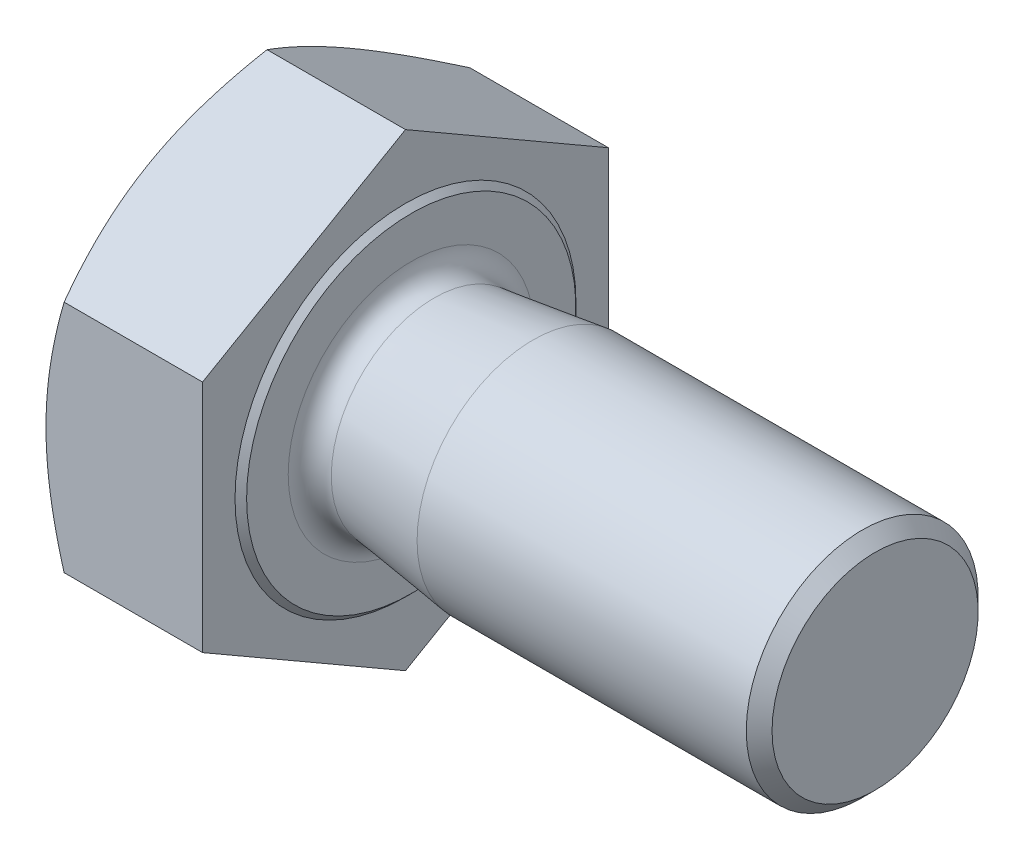
ISO-10303-21;
HEADER;
FILE_DESCRIPTION(('STEP AP214'),'2;1');
FILE_NAME('part.step','',(''),(''),'','','');
FILE_SCHEMA(('AUTOMOTIVE_DESIGN { 1 0 10303 214 1 1 1 1 }'));
ENDSEC;
DATA;
#1=APPLICATION_CONTEXT('core data for automotive mechanical design processes');
#2=APPLICATION_PROTOCOL_DEFINITION('international standard','automotive_design',2000,#1);
#3=PRODUCT_CONTEXT('',#1,'mechanical');
#4=PRODUCT('Part','Part','',(#3));
#5=PRODUCT_RELATED_PRODUCT_CATEGORY('part','',(#4));
#6=PRODUCT_DEFINITION_FORMATION('','',#4);
#7=PRODUCT_DEFINITION_CONTEXT('part definition',#1,'design');
#8=PRODUCT_DEFINITION('design','',#6,#7);
#9=PRODUCT_DEFINITION_SHAPE('','',#8);
#10=(LENGTH_UNIT() NAMED_UNIT(*) SI_UNIT(.MILLI.,.METRE.));
#11=(NAMED_UNIT(*) PLANE_ANGLE_UNIT() SI_UNIT($,.RADIAN.));
#12=(NAMED_UNIT(*) SI_UNIT($,.STERADIAN.) SOLID_ANGLE_UNIT());
#13=UNCERTAINTY_MEASURE_WITH_UNIT(LENGTH_MEASURE(1.E-05),#10,'distance_accuracy_value','');
#14=(GEOMETRIC_REPRESENTATION_CONTEXT(3) GLOBAL_UNCERTAINTY_ASSIGNED_CONTEXT((#13)) GLOBAL_UNIT_ASSIGNED_CONTEXT((#10,
#11,#12)) REPRESENTATION_CONTEXT('',''));
#15=CARTESIAN_POINT('',(0.,0.,0.));
#16=DIRECTION('',(0.,0.,1.));
#17=DIRECTION('',(1.,0.,0.));
#18=AXIS2_PLACEMENT_3D('',#15,#16,#17);
#19=CARTESIAN_POINT('',(2.8,2.02072594216373,-3.49999999999998));
#20=DIRECTION('',(1.,0.,0.));
#21=DIRECTION('',(0.,0.,-1.));
#22=AXIS2_PLACEMENT_3D('',#19,#20,#21);
#23=PLANE('',#22);
#24=CARTESIAN_POINT('',(2.8,0.,0.));
#25=DIRECTION('',(-1.,0.,0.));
#26=DIRECTION('',(0.,0.,1.));
#27=AXIS2_PLACEMENT_3D('',#24,#25,#26);
#28=CIRCLE('',#27,2.122675);
#29=CARTESIAN_POINT('',(2.8,0.,2.122675));
#30=VERTEX_POINT('',#29);
#31=EDGE_CURVE('E174',#30,#30,#28,.T.);
#32=ORIENTED_EDGE('',*,*,#31,.T.);
#33=EDGE_LOOP('',(#32));
#34=FACE_BOUND('',#33,.T.);
#35=CARTESIAN_POINT('',(2.8,0.,0.));
#36=DIRECTION('',(-1.,0.,0.));
#37=DIRECTION('',(0.,0.,1.));
#38=AXIS2_PLACEMENT_3D('',#35,#36,#37);
#39=CIRCLE('',#38,2.84);
#40=CARTESIAN_POINT('',(2.8,0.,2.84));
#41=VERTEX_POINT('',#40);
#42=EDGE_CURVE('E252',#41,#41,#39,.T.);
#43=ORIENTED_EDGE('',*,*,#42,.F.);
#44=EDGE_LOOP('',(#43));
#45=FACE_BOUND('',#44,.T.);
#46=ADVANCED_FACE('F34',(#34,#45),#23,.T.);
#47=CARTESIAN_POINT('',(4.9,0.,0.));
#48=DIRECTION('',(1.,0.,0.));
#49=DIRECTION('',(0.,0.,-1.));
#50=AXIS2_PLACEMENT_3D('',#47,#48,#49);
#51=CONICAL_SURFACE('',#50,2.,0.130872739745919);
#52=CARTESIAN_POINT('',(3.19567481401543,0.,0.));
#53=DIRECTION('',(-1.,0.,0.));
#54=DIRECTION('',(0.,0.,1.));
#55=AXIS2_PLACEMENT_3D('',#52,#53,#54);
#56=CIRCLE('',#55,1.77566806726716);
#57=CARTESIAN_POINT('',(3.19567481401543,0.,1.77566806726716));
#58=VERTEX_POINT('',#57);
#59=EDGE_CURVE('E118',#58,#58,#56,.T.);
#60=ORIENTED_EDGE('',*,*,#59,.F.);
#61=EDGE_LOOP('',(#60));
#62=FACE_BOUND('',#61,.T.);
#63=CARTESIAN_POINT('',(4.9,0.,0.));
#64=DIRECTION('',(-1.,0.,0.));
#65=DIRECTION('',(0.,0.,1.));
#66=AXIS2_PLACEMENT_3D('',#63,#64,#65);
#67=CIRCLE('',#66,2.);
#68=CARTESIAN_POINT('',(4.9,0.,2.));
#69=VERTEX_POINT('',#68);
#70=EDGE_CURVE('E171',#69,#69,#67,.T.);
#71=ORIENTED_EDGE('',*,*,#70,.T.);
#72=EDGE_LOOP('',(#71));
#73=FACE_BOUND('',#72,.T.);
#74=ADVANCED_FACE('F167',(#62,#73),#51,.T.);
#75=CARTESIAN_POINT('',(2.8,0.,0.));
#76=DIRECTION('',(-1.,0.,0.));
#77=DIRECTION('',(0.,0.,1.));
#78=AXIS2_PLACEMENT_3D('',#75,#76,#77);
#79=CYLINDRICAL_SURFACE('',#78,2.);
#80=CARTESIAN_POINT('',(10.5777777777778,0.,0.));
#81=DIRECTION('',(-1.,0.,0.));
#82=DIRECTION('',(0.,0.,1.));
#83=AXIS2_PLACEMENT_3D('',#80,#81,#82);
#84=CIRCLE('',#83,2.);
#85=CARTESIAN_POINT('',(10.5777777777778,0.,2.));
#86=VERTEX_POINT('',#85);
#87=EDGE_CURVE('E152',#86,#86,#84,.T.);
#88=ORIENTED_EDGE('',*,*,#87,.T.);
#89=EDGE_LOOP('',(#88));
#90=FACE_BOUND('',#89,.T.);
#91=ORIENTED_EDGE('',*,*,#70,.F.);
#92=EDGE_LOOP('',(#91));
#93=FACE_BOUND('',#92,.T.);
#94=ADVANCED_FACE('F164',(#90,#93),#79,.T.);
#95=CARTESIAN_POINT('',(10.8,2.,0.));
#96=DIRECTION('',(-1.,0.,0.));
#97=DIRECTION('',(0.,0.,1.));
#98=AXIS2_PLACEMENT_3D('',#95,#96,#97);
#99=PLANE('',#98);
#100=CARTESIAN_POINT('',(10.8,0.,0.));
#101=DIRECTION('',(-1.,0.,0.));
#102=DIRECTION('',(0.,0.,1.));
#103=AXIS2_PLACEMENT_3D('',#100,#101,#102);
#104=CIRCLE('',#103,1.77777777777778);
#105=CARTESIAN_POINT('',(10.8,0.,1.77777777777778));
#106=VERTEX_POINT('',#105);
#107=EDGE_CURVE('E42',#106,#106,#104,.F.);
#108=ORIENTED_EDGE('',*,*,#107,.T.);
#109=EDGE_LOOP('',(#108));
#110=FACE_BOUND('',#109,.T.);
#111=ADVANCED_FACE('F157',(#110),#99,.F.);
#112=CARTESIAN_POINT('',(3.15,0.,0.));
#113=DIRECTION('',(-1.,0.,0.));
#114=DIRECTION('',(0.,0.,1.));
#115=AXIS2_PLACEMENT_3D('',#112,#113,#114);
#116=TOROIDAL_SURFACE('',#115,2.122675,0.349999999999998);
#117=ORIENTED_EDGE('',*,*,#31,.F.);
#118=EDGE_LOOP('',(#117));
#119=FACE_BOUND('',#118,.T.);
#120=ORIENTED_EDGE('',*,*,#59,.T.);
#121=EDGE_LOOP('',(#120));
#122=FACE_BOUND('',#121,.T.);
#123=ADVANCED_FACE('F161',(#119,#122),#116,.F.);
#124=CARTESIAN_POINT('',(10.5777777777778,0.,0.));
#125=DIRECTION('',(-1.,0.,0.));
#126=DIRECTION('',(0.,0.,1.));
#127=AXIS2_PLACEMENT_3D('',#124,#125,#126);
#128=CONICAL_SURFACE('',#127,2.,0.785398163397444);
#129=ORIENTED_EDGE('',*,*,#107,.F.);
#130=EDGE_LOOP('',(#129));
#131=FACE_BOUND('',#130,.T.);
#132=ORIENTED_EDGE('',*,*,#87,.F.);
#133=EDGE_LOOP('',(#132));
#134=FACE_BOUND('',#133,.T.);
#135=ADVANCED_FACE('F36',(#131,#134),#128,.T.);
#136=CARTESIAN_POINT('',(2.70000000000001,-2.94,0.));
#137=DIRECTION('',(1.,0.,0.));
#138=DIRECTION('',(0.,0.,-1.));
#139=AXIS2_PLACEMENT_3D('',#136,#137,#138);
#140=PLANE('',#139);
#141=CARTESIAN_POINT('',(2.70000000000001,0.,0.));
#142=DIRECTION('',(-1.,0.,0.));
#143=DIRECTION('',(0.,0.,1.));
#144=AXIS2_PLACEMENT_3D('',#141,#142,#143);
#145=CIRCLE('',#144,2.94);
#146=CARTESIAN_POINT('',(2.70000000000001,0.,2.94));
#147=VERTEX_POINT('',#146);
#148=EDGE_CURVE('E254',#147,#147,#145,.T.);
#149=ORIENTED_EDGE('',*,*,#148,.T.);
#150=EDGE_LOOP('',(#149));
#151=FACE_BOUND('',#150,.T.);
#152=DIRECTION('',(0.,1.,0.));
#153=VECTOR('',#152,1.);
#154=CARTESIAN_POINT('',(2.70000000000001,-2.0207259421637,-3.49999999999999));
#155=LINE('',#154,#153);
#156=CARTESIAN_POINT('',(2.70000000000001,-2.02072594216369,-3.49999999999999));
#157=VERTEX_POINT('',#156);
#158=CARTESIAN_POINT('',(2.70000000000001,2.02072594216373,-3.49999999999998));
#159=VERTEX_POINT('',#158);
#160=EDGE_CURVE('E105',#157,#159,#155,.T.);
#161=ORIENTED_EDGE('',*,*,#160,.T.);
#162=DIRECTION('',(0.,0.499999999999997,0.86602540378444));
#163=VECTOR('',#162,1.);
#164=CARTESIAN_POINT('',(2.70000000000001,2.02072594216373,-3.49999999999998));
#165=LINE('',#164,#163);
#166=CARTESIAN_POINT('',(2.70000000000001,4.04145188432739,0.));
#167=VERTEX_POINT('',#166);
#168=EDGE_CURVE('E119',#159,#167,#165,.T.);
#169=ORIENTED_EDGE('',*,*,#168,.T.);
#170=DIRECTION('',(0.,-0.499999999999999,0.866025403784439));
#171=VECTOR('',#170,1.);
#172=CARTESIAN_POINT('',(2.70000000000001,4.04145188432739,0.));
#173=LINE('',#172,#171);
#174=CARTESIAN_POINT('',(2.70000000000001,2.0207259421637,3.50000000000002));
#175=VERTEX_POINT('',#174);
#176=EDGE_CURVE('E262',#167,#175,#173,.T.);
#177=ORIENTED_EDGE('',*,*,#176,.T.);
#178=DIRECTION('',(0.,-1.,0.));
#179=VECTOR('',#178,1.);
#180=CARTESIAN_POINT('',(2.70000000000001,2.0207259421637,3.50000000000002));
#181=LINE('',#180,#179);
#182=CARTESIAN_POINT('',(2.70000000000001,-2.02072594216368,3.50000000000001));
#183=VERTEX_POINT('',#182);
#184=EDGE_CURVE('E260',#175,#183,#181,.T.);
#185=ORIENTED_EDGE('',*,*,#184,.T.);
#186=DIRECTION('',(0.,-0.499999999999998,-0.86602540378444));
#187=VECTOR('',#186,1.);
#188=CARTESIAN_POINT('',(2.70000000000001,-2.02072594216368,3.50000000000001));
#189=LINE('',#188,#187);
#190=CARTESIAN_POINT('',(2.70000000000001,-4.04145188432738,0.));
#191=VERTEX_POINT('',#190);
#192=EDGE_CURVE('E48',#183,#191,#189,.T.);
#193=ORIENTED_EDGE('',*,*,#192,.T.);
#194=DIRECTION('',(0.,0.5,-0.866025403784438));
#195=VECTOR('',#194,1.);
#196=CARTESIAN_POINT('',(2.70000000000001,-4.04145188432738,0.));
#197=LINE('',#196,#195);
#198=EDGE_CURVE('E11',#191,#157,#197,.T.);
#199=ORIENTED_EDGE('',*,*,#198,.T.);
#200=EDGE_LOOP('',(#161,#169,#177,#185,#193,#199));
#201=FACE_BOUND('',#200,.T.);
#202=ADVANCED_FACE('F104',(#151,#201),#140,.T.);
#203=CARTESIAN_POINT('',(2.70000000000001,0.,0.));
#204=DIRECTION('',(-1.,0.,0.));
#205=DIRECTION('',(0.,0.,1.));
#206=AXIS2_PLACEMENT_3D('',#203,#204,#205);
#207=CONICAL_SURFACE('',#206,2.94,0.785398163397448);
#208=ORIENTED_EDGE('',*,*,#42,.T.);
#209=EDGE_LOOP('',(#208));
#210=FACE_BOUND('',#209,.T.);
#211=ORIENTED_EDGE('',*,*,#148,.F.);
#212=EDGE_LOOP('',(#211));
#213=FACE_BOUND('',#212,.T.);
#214=ADVANCED_FACE('F277',(#210,#213),#207,.T.);
#215=CARTESIAN_POINT('',(0.,2.02072594216373,-3.49999999999998));
#216=DIRECTION('',(1.,0.,0.));
#217=DIRECTION('',(0.,0.,-1.));
#218=AXIS2_PLACEMENT_3D('',#215,#216,#217);
#219=PLANE('',#218);
#220=CARTESIAN_POINT('',(0.,0.,0.));
#221=DIRECTION('',(1.,0.,0.));
#222=DIRECTION('',(0.,0.,-1.));
#223=AXIS2_PLACEMENT_3D('',#220,#221,#222);
#224=CIRCLE('',#223,3.5);
#225=CARTESIAN_POINT('',(0.,0.,-3.5));
#226=VERTEX_POINT('',#225);
#227=CARTESIAN_POINT('',(0.,3.03108891324554,-1.74999999999999));
#228=VERTEX_POINT('',#227);
#229=EDGE_CURVE('E151',#226,#228,#224,.T.);
#230=ORIENTED_EDGE('',*,*,#229,.F.);
#231=CARTESIAN_POINT('',(0.,-3.03108891324553,-1.75));
#232=VERTEX_POINT('',#231);
#233=EDGE_CURVE('E147',#232,#226,#224,.T.);
#234=ORIENTED_EDGE('',*,*,#233,.F.);
#235=CARTESIAN_POINT('',(0.,-3.03108891324554,1.75));
#236=VERTEX_POINT('',#235);
#237=EDGE_CURVE('E150',#236,#232,#224,.T.);
#238=ORIENTED_EDGE('',*,*,#237,.F.);
#239=CARTESIAN_POINT('',(0.,0.,3.5));
#240=VERTEX_POINT('',#239);
#241=EDGE_CURVE('E318',#240,#236,#224,.T.);
#242=ORIENTED_EDGE('',*,*,#241,.F.);
#243=CARTESIAN_POINT('',(0.,0.,0.));
#244=DIRECTION('',(-1.,0.,0.));
#245=DIRECTION('',(0.,0.,1.));
#246=AXIS2_PLACEMENT_3D('',#243,#244,#245);
#247=CIRCLE('',#246,3.5);
#248=CARTESIAN_POINT('',(0.,3.03108891324554,1.75));
#249=VERTEX_POINT('',#248);
#250=EDGE_CURVE('E173',#240,#249,#247,.T.);
#251=ORIENTED_EDGE('',*,*,#250,.T.);
#252=EDGE_CURVE('E295',#228,#249,#224,.T.);
#253=ORIENTED_EDGE('',*,*,#252,.F.);
#254=EDGE_LOOP('',(#230,#234,#238,#242,#251,#253));
#255=FACE_BOUND('',#254,.T.);
#256=ADVANCED_FACE('F280',(#255),#219,.F.);
#257=CARTESIAN_POINT('',(0.,0.,0.));
#258=DIRECTION('',(1.,0.,0.));
#259=DIRECTION('',(0.,0.,1.));
#260=AXIS2_PLACEMENT_3D('',#257,#258,#259);
#261=CONICAL_SURFACE('',#260,3.5,1.0471975511966);
#262=CARTESIAN_POINT('',(0.312674060693374,4.04156735438123,0.000199999999997554));
#263=CARTESIAN_POINT('',(0.261385788989986,3.95276673849841,-0.153607178452453));
#264=CARTESIAN_POINT('',(0.2147409538162,3.86319960126199,-0.308742010834428));
#265=CARTESIAN_POINT('',(0.133321875533353,3.68251437287563,-0.621698006576787));
#266=CARTESIAN_POINT('',(0.098576435584566,3.59139307116726,-0.779524730787502));
#267=CARTESIAN_POINT('',(0.0444900271828416,3.41027974688035,-1.09322221038013));
#268=CARTESIAN_POINT('',(0.0247890862603876,3.32031559103709,-1.2490446991607));
#269=CARTESIAN_POINT('',(0.00127013273726129,3.13996396008053,-1.56142288720538));
#270=CARTESIAN_POINT('',(-0.00256735545442747,3.04957714051107,-1.71797745103424));
#271=CARTESIAN_POINT('',(0.00541530187698564,2.88068384499779,-2.010509219921));
#272=CARTESIAN_POINT('',(0.0152754340696151,2.80215208834116,-2.14653021245791));
#273=CARTESIAN_POINT('',(0.0465264668994108,2.64560020969756,-2.417686020289));
#274=CARTESIAN_POINT('',(0.0679280432858047,2.56758062920652,-2.55281989768468));
#275=CARTESIAN_POINT('',(0.121430407880582,2.41070596159681,-2.82453479240518));
#276=CARTESIAN_POINT('',(0.153757994445091,2.33187072981466,-2.96108141927833));
#277=CARTESIAN_POINT('',(0.227128933807996,2.17537608630786,-3.23213809294449));
#278=CARTESIAN_POINT('',(0.268155046569867,2.09771466960102,-3.36665161246852));
#279=CARTESIAN_POINT('',(0.312674060693369,2.02061047210989,-3.50019999999998));
#280=B_SPLINE_CURVE_WITH_KNOTS('',3,(#262,#263,#264,#265,#266,#267,#268,#269,#270,#271,#272,
#273,#274,#275,#276,#277,#278,#279),.UNSPECIFIED.,.F.,.F.,(4,2,2,2,2,2,2,2,4),(0.,
0.554793832886255,1.11092123814984,1.65328467083219,2.19498204478404,2.66665130850859,
3.13875761298266,3.62133612600507,4.10296698719184),.UNSPECIFIED.);
#281=CARTESIAN_POINT('',(0.312607391169641,2.02072594216373,-3.49999999999998));
#282=VERTEX_POINT('',#281);
#283=EDGE_CURVE('E225',#228,#282,#280,.T.);
#284=ORIENTED_EDGE('',*,*,#283,.T.);
#285=CARTESIAN_POINT('',(1.67735179970693,-5.36445122587175,-3.49999999999999));
#286=CARTESIAN_POINT('',(1.60304897968235,-5.21074095850692,-3.49999999999999));
#287=CARTESIAN_POINT('',(1.52948320275514,-5.05666785622575,-3.49999999999999));
#288=CARTESIAN_POINT('',(1.38424678663944,-4.74759982374652,-3.49999999999999));
#289=CARTESIAN_POINT('',(1.31257647435595,-4.592604740111,-3.49999999999999));
#290=CARTESIAN_POINT('',(1.17117560709257,-4.28066187388812,-3.49999999999999));
#291=CARTESIAN_POINT('',(1.10145845089127,-4.12370799579494,-3.49999999999999));
#292=CARTESIAN_POINT('',(0.965011192686831,-3.80851213310474,-3.49999999999999));
#293=CARTESIAN_POINT('',(0.898280935421653,-3.65027021596783,-3.49999999999999));
#294=CARTESIAN_POINT('',(0.767799412162109,-3.33025803293006,-3.49999999999999));
#295=CARTESIAN_POINT('',(0.704095485222872,-3.16846835880931,-3.49999999999999));
#296=CARTESIAN_POINT('',(0.581663966161333,-2.84298253492041,-3.49999999999999));
#297=CARTESIAN_POINT('',(0.522936927053057,-2.67928617558086,-3.49999999999999));
#298=CARTESIAN_POINT('',(0.412033373356312,-2.35006103544984,-3.49999999999999));
#299=CARTESIAN_POINT('',(0.359842977369367,-2.18453697895634,-3.49999999999999));
#300=CARTESIAN_POINT('',(0.263704323395195,-1.85113548066547,-3.49999999999999));
#301=CARTESIAN_POINT('',(0.219753464246378,-1.68325879962262,-3.49999999999999));
#302=CARTESIAN_POINT('',(0.142224783305162,-1.34503952866,-3.49999999999999));
#303=CARTESIAN_POINT('',(0.108649447364925,-1.17469635801661,-3.49999999999999));
#304=CARTESIAN_POINT('',(0.0541279450428465,-0.83195045796229,-3.49999999999999));
#305=CARTESIAN_POINT('',(0.0331817842005047,-0.659547727648018,-3.49999999999999));
#306=CARTESIAN_POINT('',(0.00577149435078701,-0.314680444257635,-3.49999999999999));
#307=CARTESIAN_POINT('',(-0.000784859200291463,-0.142223412041645,-3.49999999999999));
#308=CARTESIAN_POINT('',(0.000935079877112075,0.202578485071078,-3.49999999999999));
#309=CARTESIAN_POINT('',(0.00920749540633213,0.374923367504801,-3.49999999999999));
#310=CARTESIAN_POINT('',(0.0353981923789657,0.669064193608477,-3.49999999999998));
#311=CARTESIAN_POINT('',(0.0498704314285749,0.791184272040279,-3.49999999999998));
#312=CARTESIAN_POINT('',(0.0853217414158775,1.03448457473146,-3.49999999999998));
#313=CARTESIAN_POINT('',(0.10630183417363,1.15566464833271,-3.49999999999998));
#314=CARTESIAN_POINT('',(0.177903239900954,1.51769420969913,-3.49999999999998));
#315=CARTESIAN_POINT('',(0.237167361292421,1.75685078274433,-3.49999999999998));
#316=CARTESIAN_POINT('',(0.33942597877697,2.11472228637646,-3.49999999999998));
#317=CARTESIAN_POINT('',(0.376262295916468,2.23530152406214,-3.49999999999998));
#318=CARTESIAN_POINT('',(0.453590908011025,2.4752016129072,-3.49999999999998));
#319=CARTESIAN_POINT('',(0.494080685478361,2.59452326826086,-3.49999999999998));
#320=CARTESIAN_POINT('',(0.577872821756922,2.83140929799296,-3.49999999999998));
#321=CARTESIAN_POINT('',(0.621158086148754,2.9489797807158,-3.49999999999998));
#322=CARTESIAN_POINT('',(0.710276353197374,3.18320761808545,-3.49999999999998));
#323=CARTESIAN_POINT('',(0.756110381183202,3.29986458339216,-3.49999999999998));
#324=CARTESIAN_POINT('',(0.802967511414852,3.41609926075739,-3.49999999999998));
#325=B_SPLINE_CURVE_WITH_KNOTS('',3,(#285,#286,#287,#288,#289,#290,#291,#292,#293,#294,#295,
#296,#297,#298,#299,#300,#301,#302,#303,#304,#305,#306,#307,#308,#309,#310,#311,#312,#313,#314,
#315,#316,#317,#318,#319,#320,#321,#322,#323,#324),.UNSPECIFIED.,.F.,.F.,(4,2,2,2,2,2,2,2,2,2,2,
2,2,2,2,2,2,2,2,4),(0.,0.512188258297074,1.0244642835736,1.53966280785379,2.05483452041718,
2.57640982202291,3.09804300343341,3.61854893838689,4.13889027568866,4.65935618411286,
5.17982232082741,5.69694291874347,6.21392833109878,6.5826722605012,6.95147411696345,
7.68962487817894,8.06783589830222,8.44578826649654,8.82161551683719,9.19759506619643),.UNSPECIFIED.);
#326=EDGE_CURVE('E297',#282,#226,#325,.F.);
#327=ORIENTED_EDGE('',*,*,#326,.T.);
#328=ORIENTED_EDGE('',*,*,#229,.T.);
#329=EDGE_LOOP('',(#284,#327,#328));
#330=FACE_BOUND('',#329,.T.);
#331=ADVANCED_FACE('F284',(#330),#261,.T.);
#332=CARTESIAN_POINT('',(0.312674060693378,2.02061047210986,3.50020000000002));
#333=CARTESIAN_POINT('',(0.26138578898999,2.10941108799268,3.34639282154757));
#334=CARTESIAN_POINT('',(0.214740953816203,2.1989782252291,3.19125798916559));
#335=CARTESIAN_POINT('',(0.133321875533355,2.37966345361545,2.87830199342323));
#336=CARTESIAN_POINT('',(0.098576435584567,2.47078475532383,2.72047526921252));
#337=CARTESIAN_POINT('',(0.044490027182841,2.65189807961074,2.40677778961988));
#338=CARTESIAN_POINT('',(0.024789086260386,2.741862235454,2.25095530083932));
#339=CARTESIAN_POINT('',(0.00127013273725838,2.92221386641056,1.93857711279464));
#340=CARTESIAN_POINT('',(-0.0025673554544308,3.01260068598002,1.78202254896578));
#341=CARTESIAN_POINT('',(0.00541530187698125,3.1814939814933,1.48949078007902));
#342=CARTESIAN_POINT('',(0.0152754340696104,3.26002573814993,1.3534697875421));
#343=CARTESIAN_POINT('',(0.0465264668994065,3.41657761679354,1.08231397971101));
#344=CARTESIAN_POINT('',(0.067928043285801,3.49459719728458,0.947180102315321));
#345=CARTESIAN_POINT('',(0.12143040788058,3.65147186489429,0.675465207594818));
#346=CARTESIAN_POINT('',(0.15375799444509,3.73030709667644,0.538918580721666));
#347=CARTESIAN_POINT('',(0.227128933807997,3.88680174018325,0.267861907055498));
#348=CARTESIAN_POINT('',(0.268155046569869,3.9644631568901,0.133348387531462));
#349=CARTESIAN_POINT('',(0.312674060693374,4.04156735438123,-0.000200000000002634));
#350=B_SPLINE_CURVE_WITH_KNOTS('',3,(#332,#333,#334,#335,#336,#337,#338,#339,#340,#341,#342,
#343,#344,#345,#346,#347,#348,#349),.UNSPECIFIED.,.F.,.F.,(4,2,2,2,2,2,2,2,4),(0.,
0.554793832886256,1.11092123814984,1.65328467083219,2.19498204478404,2.66665130850861,
3.13875761298269,3.62133612600511,4.10296698719189),.UNSPECIFIED.);
#351=CARTESIAN_POINT('',(0.312607391169646,4.04145188432739,0.));
#352=VERTEX_POINT('',#351);
#353=EDGE_CURVE('E131',#249,#352,#350,.T.);
#354=ORIENTED_EDGE('',*,*,#353,.T.);
#355=EDGE_CURVE('E56',#352,#228,#280,.T.);
#356=ORIENTED_EDGE('',*,*,#355,.T.);
#357=ORIENTED_EDGE('',*,*,#252,.T.);
#358=EDGE_LOOP('',(#354,#356,#357));
#359=FACE_BOUND('',#358,.T.);
#360=ADVANCED_FACE('F205',(#359),#261,.T.);
#361=CARTESIAN_POINT('',(0.31260739116965,2.0207259421637,3.50000000000002));
#362=VERTEX_POINT('',#361);
#363=EDGE_CURVE('E127',#362,#249,#350,.T.);
#364=ORIENTED_EDGE('',*,*,#363,.T.);
#365=ORIENTED_EDGE('',*,*,#250,.F.);
#366=CARTESIAN_POINT('',(1.67735176125261,-5.36445114634429,3.5));
#367=CARTESIAN_POINT('',(1.60304894287284,-5.21074088170208,3.5));
#368=CARTESIAN_POINT('',(1.52948316758945,-5.05666778214559,3.50000000000001));
#369=CARTESIAN_POINT('',(1.38424675475264,-4.74759975512485,3.50000000000001));
#370=CARTESIAN_POINT('',(1.31257644410422,-4.59260467422311,3.50000000000001));
#371=CARTESIAN_POINT('',(1.17117558011176,-4.28066181351336,3.50000000000001));
#372=CARTESIAN_POINT('',(1.10145842554596,-4.12370793819971,3.50000000000001));
#373=CARTESIAN_POINT('',(0.965011170582474,-3.80851208108921,3.50000000000001));
#374=CARTESIAN_POINT('',(0.898280914922754,-3.65027016675245,3.50000000000001));
#375=CARTESIAN_POINT('',(0.767799394847256,-3.33025798939173,3.50000000000001));
#376=CARTESIAN_POINT('',(0.704095469485719,-3.16846831814838,3.50000000000001));
#377=CARTESIAN_POINT('',(0.581663953492218,-2.84298250006234,3.50000000000001));
#378=CARTESIAN_POINT('',(0.522936915874247,-2.67928614364827,3.50000000000001));
#379=CARTESIAN_POINT('',(0.412033365010009,-2.35006100942345,3.50000000000001));
#380=CARTESIAN_POINT('',(0.359842970365747,-2.18453695591045,3.50000000000001));
#381=CARTESIAN_POINT('',(0.263704318850158,-1.85113546366258,3.50000000000001));
#382=CARTESIAN_POINT('',(0.21975346081739,-1.68325878568218,3.50000000000001));
#383=CARTESIAN_POINT('',(0.142224782134613,-1.34503952253594,3.50000000000001));
#384=CARTESIAN_POINT('',(0.108649447238784,-1.17469635666939,3.50000000000001));
#385=CARTESIAN_POINT('',(0.0541279462774262,-0.831950466276376,3.50000000000001));
#386=CARTESIAN_POINT('',(0.0331817857519209,-0.659547740846492,3.50000000000001));
#387=CARTESIAN_POINT('',(0.00577149567581701,-0.314680467201352,3.50000000000001));
#388=CARTESIAN_POINT('',(-0.000784858411238384,-0.142223439845891,3.50000000000001));
#389=CARTESIAN_POINT('',(0.000935078763303033,0.202578447628136,3.50000000000001));
#390=CARTESIAN_POINT('',(0.00920749292545809,0.374923325283672,3.50000000000001));
#391=CARTESIAN_POINT('',(0.0353981871603865,0.669064145282706,3.50000000000001));
#392=CARTESIAN_POINT('',(0.0498704251148076,0.791184222334871,3.50000000000002));
#393=CARTESIAN_POINT('',(0.0853217328514924,1.03448452232488,3.50000000000002));
#394=CARTESIAN_POINT('',(0.106301824453805,1.1556645946046,3.50000000000002));
#395=CARTESIAN_POINT('',(0.17790322668683,1.51769415207028,3.50000000000002));
#396=CARTESIAN_POINT('',(0.237167345713756,1.75685072260838,3.50000000000002));
#397=CARTESIAN_POINT('',(0.339425959700777,2.11472222249332,3.50000000000002));
#398=CARTESIAN_POINT('',(0.376262275665957,2.23530145890899,3.50000000000002));
#399=CARTESIAN_POINT('',(0.453590885445894,2.47520154522853,3.50000000000002));
#400=CARTESIAN_POINT('',(0.494080661772943,2.59452319932665,3.50000000000002));
#401=CARTESIAN_POINT('',(0.577872795815742,2.83140922656602,3.50000000000002));
#402=CARTESIAN_POINT('',(0.621158059112071,2.94897970805157,3.50000000000002));
#403=CARTESIAN_POINT('',(0.710276324002828,3.18320754294393,3.50000000000002));
#404=CARTESIAN_POINT('',(0.756110350926261,3.29986450701066,3.50000000000002));
#405=CARTESIAN_POINT('',(0.802967480111912,3.41609918313381,3.50000000000002));
#406=B_SPLINE_CURVE_WITH_KNOTS('',3,(#366,#367,#368,#369,#370,#371,#372,#373,#374,#375,#376,
#377,#378,#379,#380,#381,#382,#383,#384,#385,#386,#387,#388,#389,#390,#391,#392,#393,#394,#395,
#396,#397,#398,#399,#400,#401,#402,#403,#404,#405),.UNSPECIFIED.,.F.,.F.,(4,2,2,2,2,2,2,2,2,2,2,
2,2,2,2,2,2,2,2,4),(0.,0.512188248795761,1.0244642645694,1.5396627792372,2.05483448218898,
2.57640977402955,3.0980429456716,3.6185488708916,4.13889019846777,4.65935609225868,
5.17982221436151,5.69694279782314,6.21392819571396,6.58267212062052,6.95147397258618,
7.68962472478315,8.06783574023173,8.44578810375846,8.82161534947924,9.19759489420945),.UNSPECIFIED.);
#407=EDGE_CURVE('E308',#240,#362,#406,.T.);
#408=ORIENTED_EDGE('',*,*,#407,.T.);
#409=EDGE_LOOP('',(#364,#365,#408));
#410=FACE_BOUND('',#409,.T.);
#411=ADVANCED_FACE('F199',(#410),#261,.T.);
#412=CARTESIAN_POINT('',(0.312607391169643,-2.02072594216368,3.50000000000001));
#413=VERTEX_POINT('',#412);
#414=EDGE_CURVE('E219',#413,#240,#406,.T.);
#415=ORIENTED_EDGE('',*,*,#414,.T.);
#416=ORIENTED_EDGE('',*,*,#241,.T.);
#417=CARTESIAN_POINT('',(0.312674060693366,-4.04156735438121,-0.000200000000007791));
#418=CARTESIAN_POINT('',(0.261385788989978,-3.9527667384984,0.153607178452442));
#419=CARTESIAN_POINT('',(0.214740953816192,-3.86319960126198,0.308742010834416));
#420=CARTESIAN_POINT('',(0.133321875533344,-3.68251437287562,0.621698006576773));
#421=CARTESIAN_POINT('',(0.0985764355845572,-3.59139307116725,0.779524730787488));
#422=CARTESIAN_POINT('',(0.044490027182832,-3.41027974688033,1.09322221038012));
#423=CARTESIAN_POINT('',(0.0247890862603773,-3.32031559103708,1.24904469916068));
#424=CARTESIAN_POINT('',(0.00127013273725007,-3.13996396008052,1.56142288720537));
#425=CARTESIAN_POINT('',(-0.00256735545443892,-3.04957714051106,1.71797745103422));
#426=CARTESIAN_POINT('',(0.00541530187697371,-2.88068384499777,2.01050921992098));
#427=CARTESIAN_POINT('',(0.0152754340696033,-2.80215208834114,2.1465302124579));
#428=CARTESIAN_POINT('',(0.0465264668994,-2.64560020969753,2.41768602028899));
#429=CARTESIAN_POINT('',(0.0679280432857948,-2.56758062920649,2.55281989768468));
#430=CARTESIAN_POINT('',(0.121430407880574,-2.41070596159678,2.82453479240519));
#431=CARTESIAN_POINT('',(0.153757994445085,-2.33187072981463,2.96108141927834));
#432=CARTESIAN_POINT('',(0.227128933807993,-2.17537608630782,3.23213809294451));
#433=CARTESIAN_POINT('',(0.268155046569866,-2.09771466960098,3.36665161246855));
#434=CARTESIAN_POINT('',(0.312674060693371,-2.02061047210985,3.50020000000001));
#435=B_SPLINE_CURVE_WITH_KNOTS('',3,(#417,#418,#419,#420,#421,#422,#423,#424,#425,#426,#427,
#428,#429,#430,#431,#432,#433,#434),.UNSPECIFIED.,.F.,.F.,(4,2,2,2,2,2,2,2,4),(0.,
0.554793832886252,1.11092123814984,1.65328467083218,2.19498204478403,2.6666513085086,
3.13875761298268,3.62133612600511,4.10296698719189),.UNSPECIFIED.);
#436=EDGE_CURVE('E299',#236,#413,#435,.T.);
#437=ORIENTED_EDGE('',*,*,#436,.T.);
#438=EDGE_LOOP('',(#415,#416,#437));
#439=FACE_BOUND('',#438,.T.);
#440=ADVANCED_FACE('F204',(#439),#261,.T.);
#441=CARTESIAN_POINT('',(0.312607391169636,-2.02072594216369,-3.49999999999999));
#442=VERTEX_POINT('',#441);
#443=EDGE_CURVE('E213',#226,#442,#325,.F.);
#444=ORIENTED_EDGE('',*,*,#443,.T.);
#445=CARTESIAN_POINT('',(0.312674060693364,-2.02061047210986,-3.50019999999999));
#446=CARTESIAN_POINT('',(0.261385788989976,-2.10941108799268,-3.34639282154754));
#447=CARTESIAN_POINT('',(0.214740953816191,-2.1989782252291,-3.19125798916557));
#448=CARTESIAN_POINT('',(0.133321875533343,-2.37966345361545,-2.87830199342321));
#449=CARTESIAN_POINT('',(0.0985764355845568,-2.47078475532383,-2.72047526921249));
#450=CARTESIAN_POINT('',(0.0444900271828323,-2.65189807961074,-2.40677778961986));
#451=CARTESIAN_POINT('',(0.024789086260378,-2.741862235454,-2.2509553008393));
#452=CARTESIAN_POINT('',(0.00127013273725141,-2.92221386641056,-1.93857711279462));
#453=CARTESIAN_POINT('',(-0.00256735545443734,-3.01260068598001,-1.78202254896576));
#454=CARTESIAN_POINT('',(0.00541530187697579,-3.1814939814933,-1.489490780079));
#455=CARTESIAN_POINT('',(0.0152754340696054,-3.26002573814993,-1.35346978754209));
#456=CARTESIAN_POINT('',(0.0465264668994018,-3.41657761679354,-1.082313979711));
#457=CARTESIAN_POINT('',(0.0679280432857961,-3.49459719728458,-0.947180102315316));
#458=CARTESIAN_POINT('',(0.121430407880574,-3.65147186489429,-0.675465207594818));
#459=CARTESIAN_POINT('',(0.153757994445084,-3.73030709667644,-0.538918580721667));
#460=CARTESIAN_POINT('',(0.22712893380799,-3.88680174018324,-0.267861907055504));
#461=CARTESIAN_POINT('',(0.268155046569862,-3.96446315689008,-0.13334838753147));
#462=CARTESIAN_POINT('',(0.312674060693365,-4.04156735438121,0.000199999999992362));
#463=B_SPLINE_CURVE_WITH_KNOTS('',3,(#445,#446,#447,#448,#449,#450,#451,#452,#453,#454,#455,
#456,#457,#458,#459,#460,#461,#462),.UNSPECIFIED.,.F.,.F.,(4,2,2,2,2,2,2,2,4),(0.,
0.554793832886253,1.11092123814983,1.65328467083218,2.19498204478403,2.66665130850859,
3.13875761298266,3.62133612600508,4.10296698719185),.UNSPECIFIED.);
#464=EDGE_CURVE('E125',#442,#232,#463,.T.);
#465=ORIENTED_EDGE('',*,*,#464,.T.);
#466=ORIENTED_EDGE('',*,*,#233,.T.);
#467=EDGE_LOOP('',(#444,#465,#466));
#468=FACE_BOUND('',#467,.T.);
#469=ADVANCED_FACE('F316',(#468),#261,.T.);
#470=CARTESIAN_POINT('',(0.312607391169638,-4.04145188432738,0.));
#471=VERTEX_POINT('',#470);
#472=EDGE_CURVE('E190',#471,#236,#435,.T.);
#473=ORIENTED_EDGE('',*,*,#472,.T.);
#474=ORIENTED_EDGE('',*,*,#237,.T.);
#475=EDGE_CURVE('E177',#232,#471,#463,.T.);
#476=ORIENTED_EDGE('',*,*,#475,.T.);
#477=EDGE_LOOP('',(#473,#474,#476));
#478=FACE_BOUND('',#477,.T.);
#479=ADVANCED_FACE('F207',(#478),#261,.T.);
#480=CARTESIAN_POINT('',(2.8,-4.04145188432738,0.));
#481=DIRECTION('',(0.,0.866025403784438,0.5));
#482=DIRECTION('',(0.,-0.5,0.866025403784438));
#483=AXIS2_PLACEMENT_3D('',#480,#481,#482);
#484=PLANE('',#483);
#485=ORIENTED_EDGE('',*,*,#198,.F.);
#486=DIRECTION('',(-1.,0.,0.));
#487=VECTOR('',#486,1.);
#488=CARTESIAN_POINT('',(2.8,-4.04145188432738,0.));
#489=LINE('',#488,#487);
#490=EDGE_CURVE('E126',#191,#471,#489,.T.);
#491=ORIENTED_EDGE('',*,*,#490,.T.);
#492=ORIENTED_EDGE('',*,*,#475,.F.);
#493=ORIENTED_EDGE('',*,*,#464,.F.);
#494=DIRECTION('',(-1.,0.,0.));
#495=VECTOR('',#494,1.);
#496=CARTESIAN_POINT('',(2.8,-2.0207259421637,-3.49999999999999));
#497=LINE('',#496,#495);
#498=EDGE_CURVE('E114',#157,#442,#497,.T.);
#499=ORIENTED_EDGE('',*,*,#498,.F.);
#500=EDGE_LOOP('',(#485,#491,#492,#493,#499));
#501=FACE_BOUND('',#500,.T.);
#502=ADVANCED_FACE('F122',(#501),#484,.F.);
#503=CARTESIAN_POINT('',(2.8,-2.02072594216368,3.50000000000001));
#504=DIRECTION('',(0.,0.86602540378444,-0.499999999999998));
#505=DIRECTION('',(0.,0.499999999999998,0.86602540378444));
#506=AXIS2_PLACEMENT_3D('',#503,#504,#505);
#507=PLANE('',#506);
#508=ORIENTED_EDGE('',*,*,#192,.F.);
#509=DIRECTION('',(-1.,0.,0.));
#510=VECTOR('',#509,1.);
#511=CARTESIAN_POINT('',(2.8,-2.02072594216368,3.50000000000001));
#512=LINE('',#511,#510);
#513=EDGE_CURVE('E129',#183,#413,#512,.T.);
#514=ORIENTED_EDGE('',*,*,#513,.T.);
#515=ORIENTED_EDGE('',*,*,#436,.F.);
#516=ORIENTED_EDGE('',*,*,#472,.F.);
#517=ORIENTED_EDGE('',*,*,#490,.F.);
#518=EDGE_LOOP('',(#508,#514,#515,#516,#517));
#519=FACE_BOUND('',#518,.T.);
#520=ADVANCED_FACE('F320',(#519),#507,.F.);
#521=CARTESIAN_POINT('',(2.8,2.0207259421637,3.50000000000002));
#522=DIRECTION('',(0.,0.,-1.));
#523=DIRECTION('',(0.,1.,0.));
#524=AXIS2_PLACEMENT_3D('',#521,#522,#523);
#525=PLANE('',#524);
#526=ORIENTED_EDGE('',*,*,#184,.F.);
#527=DIRECTION('',(-1.,0.,0.));
#528=VECTOR('',#527,1.);
#529=CARTESIAN_POINT('',(2.8,2.0207259421637,3.50000000000002));
#530=LINE('',#529,#528);
#531=EDGE_CURVE('E142',#175,#362,#530,.T.);
#532=ORIENTED_EDGE('',*,*,#531,.T.);
#533=ORIENTED_EDGE('',*,*,#407,.F.);
#534=ORIENTED_EDGE('',*,*,#414,.F.);
#535=ORIENTED_EDGE('',*,*,#513,.F.);
#536=EDGE_LOOP('',(#526,#532,#533,#534,#535));
#537=FACE_BOUND('',#536,.T.);
#538=ADVANCED_FACE('F324',(#537),#525,.F.);
#539=CARTESIAN_POINT('',(2.8,4.04145188432739,0.));
#540=DIRECTION('',(0.,-0.866025403784439,-0.499999999999999));
#541=DIRECTION('',(0.,0.499999999999999,-0.866025403784439));
#542=AXIS2_PLACEMENT_3D('',#539,#540,#541);
#543=PLANE('',#542);
#544=ORIENTED_EDGE('',*,*,#176,.F.);
#545=DIRECTION('',(-1.,0.,0.));
#546=VECTOR('',#545,1.);
#547=CARTESIAN_POINT('',(2.8,4.04145188432739,0.));
#548=LINE('',#547,#546);
#549=EDGE_CURVE('E144',#167,#352,#548,.T.);
#550=ORIENTED_EDGE('',*,*,#549,.T.);
#551=ORIENTED_EDGE('',*,*,#353,.F.);
#552=ORIENTED_EDGE('',*,*,#363,.F.);
#553=ORIENTED_EDGE('',*,*,#531,.F.);
#554=EDGE_LOOP('',(#544,#550,#551,#552,#553));
#555=FACE_BOUND('',#554,.T.);
#556=ADVANCED_FACE('F235',(#555),#543,.F.);
#557=CARTESIAN_POINT('',(2.8,2.02072594216373,-3.49999999999998));
#558=DIRECTION('',(0.,-0.86602540378444,0.499999999999997));
#559=DIRECTION('',(0.,-0.499999999999997,-0.86602540378444));
#560=AXIS2_PLACEMENT_3D('',#557,#558,#559);
#561=PLANE('',#560);
#562=ORIENTED_EDGE('',*,*,#168,.F.);
#563=DIRECTION('',(-1.,0.,0.));
#564=VECTOR('',#563,1.);
#565=CARTESIAN_POINT('',(2.8,2.02072594216373,-3.49999999999998));
#566=LINE('',#565,#564);
#567=EDGE_CURVE('E117',#159,#282,#566,.T.);
#568=ORIENTED_EDGE('',*,*,#567,.T.);
#569=ORIENTED_EDGE('',*,*,#283,.F.);
#570=ORIENTED_EDGE('',*,*,#355,.F.);
#571=ORIENTED_EDGE('',*,*,#549,.F.);
#572=EDGE_LOOP('',(#562,#568,#569,#570,#571));
#573=FACE_BOUND('',#572,.T.);
#574=ADVANCED_FACE('F232',(#573),#561,.F.);
#575=CARTESIAN_POINT('',(2.8,-2.0207259421637,-3.49999999999999));
#576=DIRECTION('',(0.,0.,1.));
#577=DIRECTION('',(0.,-1.,0.));
#578=AXIS2_PLACEMENT_3D('',#575,#576,#577);
#579=PLANE('',#578);
#580=ORIENTED_EDGE('',*,*,#160,.F.);
#581=ORIENTED_EDGE('',*,*,#498,.T.);
#582=ORIENTED_EDGE('',*,*,#443,.F.);
#583=ORIENTED_EDGE('',*,*,#326,.F.);
#584=ORIENTED_EDGE('',*,*,#567,.F.);
#585=EDGE_LOOP('',(#580,#581,#582,#583,#584));
#586=FACE_BOUND('',#585,.T.);
#587=ADVANCED_FACE('F112',(#586),#579,.F.);
#588=CLOSED_SHELL('',(#46,#74,#94,#111,#123,#135,#202,#214,#256,#331,#360,#411,#440,#469,#479,
#502,#520,#538,#556,#574,#587));
#589=MANIFOLD_SOLID_BREP('B2',#588);
#590=ADVANCED_BREP_SHAPE_REPRESENTATION('',(#18,#589),#14);
#591=SHAPE_DEFINITION_REPRESENTATION(#9,#590);
ENDSEC;
END-ISO-10303-21;
